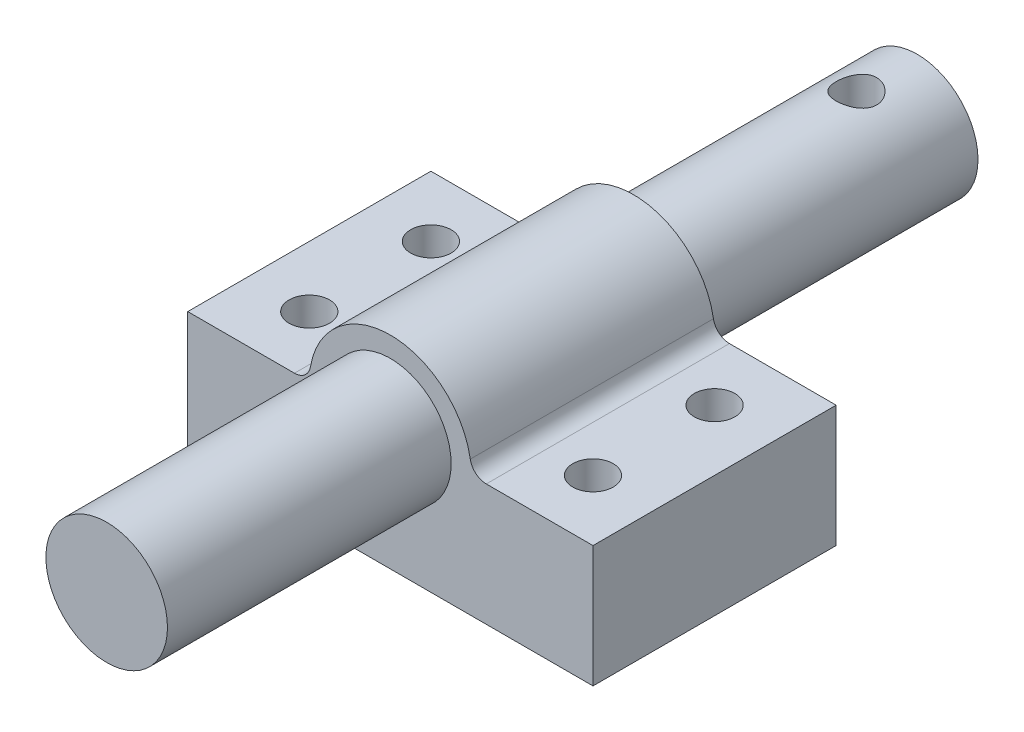
ISO-10303-21;
HEADER;
FILE_DESCRIPTION(('STEP AP214'),'2;1');
FILE_NAME('part.step','',(''),(''),'','','');
FILE_SCHEMA(('AUTOMOTIVE_DESIGN { 1 0 10303 214 1 1 1 1 }'));
ENDSEC;
DATA;
#1=APPLICATION_CONTEXT('core data for automotive mechanical design processes');
#2=APPLICATION_PROTOCOL_DEFINITION('international standard','automotive_design',2000,#1);
#3=PRODUCT_CONTEXT('',#1,'mechanical');
#4=PRODUCT('Part','Part','',(#3));
#5=PRODUCT_RELATED_PRODUCT_CATEGORY('part','',(#4));
#6=PRODUCT_DEFINITION_FORMATION('','',#4);
#7=PRODUCT_DEFINITION_CONTEXT('part definition',#1,'design');
#8=PRODUCT_DEFINITION('design','',#6,#7);
#9=PRODUCT_DEFINITION_SHAPE('','',#8);
#10=(LENGTH_UNIT() NAMED_UNIT(*) SI_UNIT(.MILLI.,.METRE.));
#11=(NAMED_UNIT(*) PLANE_ANGLE_UNIT() SI_UNIT($,.RADIAN.));
#12=(NAMED_UNIT(*) SI_UNIT($,.STERADIAN.) SOLID_ANGLE_UNIT());
#13=UNCERTAINTY_MEASURE_WITH_UNIT(LENGTH_MEASURE(1.E-05),#10,'distance_accuracy_value','');
#14=(GEOMETRIC_REPRESENTATION_CONTEXT(3) GLOBAL_UNCERTAINTY_ASSIGNED_CONTEXT((#13)) GLOBAL_UNIT_ASSIGNED_CONTEXT((#10,
#11,#12)) REPRESENTATION_CONTEXT('',''));
#15=CARTESIAN_POINT('',(0.,0.,0.));
#16=DIRECTION('',(0.,0.,1.));
#17=DIRECTION('',(1.,0.,0.));
#18=AXIS2_PLACEMENT_3D('',#15,#16,#17);
#19=CARTESIAN_POINT('',(7.5,0.,0.));
#20=DIRECTION('',(0.,0.,1.));
#21=DIRECTION('',(1.,0.,0.));
#22=AXIS2_PLACEMENT_3D('',#19,#20,#21);
#23=PLANE('',#22);
#24=CARTESIAN_POINT('',(0.,0.,0.));
#25=DIRECTION('',(0.,0.,1.));
#26=DIRECTION('',(1.,0.,0.));
#27=AXIS2_PLACEMENT_3D('',#24,#25,#26);
#28=CIRCLE('',#27,7.5);
#29=CARTESIAN_POINT('',(7.5,0.,0.));
#30=VERTEX_POINT('',#29);
#31=EDGE_CURVE('E112',#30,#30,#28,.T.);
#32=ORIENTED_EDGE('',*,*,#31,.T.);
#33=EDGE_LOOP('',(#32));
#34=FACE_BOUND('',#33,.T.);
#35=ADVANCED_FACE('F33',(#34),#23,.T.);
#36=CARTESIAN_POINT('',(7.5,0.,-35.));
#37=DIRECTION('',(0.,0.,1.));
#38=DIRECTION('',(1.,0.,0.));
#39=AXIS2_PLACEMENT_3D('',#36,#37,#38);
#40=PLANE('',#39);
#41=CARTESIAN_POINT('',(0.,0.,-35.));
#42=DIRECTION('',(0.,0.,1.));
#43=DIRECTION('',(1.,0.,0.));
#44=AXIS2_PLACEMENT_3D('',#41,#42,#43);
#45=CIRCLE('',#44,7.5);
#46=CARTESIAN_POINT('',(7.5,0.,-35.));
#47=VERTEX_POINT('',#46);
#48=EDGE_CURVE('E174',#47,#47,#45,.T.);
#49=ORIENTED_EDGE('',*,*,#48,.F.);
#50=EDGE_LOOP('',(#49));
#51=FACE_BOUND('',#50,.T.);
#52=DIRECTION('',(-1.,0.,0.));
#53=VECTOR('',#52,1.);
#54=CARTESIAN_POINT('',(25.,0.,-35.));
#55=LINE('',#54,#53);
#56=CARTESIAN_POINT('',(25.,0.,-35.));
#57=VERTEX_POINT('',#56);
#58=CARTESIAN_POINT('',(11.8321595661992,0.,-35.));
#59=VERTEX_POINT('',#58);
#60=EDGE_CURVE('E147',#57,#59,#55,.T.);
#61=ORIENTED_EDGE('',*,*,#60,.T.);
#62=CARTESIAN_POINT('',(11.8321595661992,2.,-35.));
#63=DIRECTION('',(0.,0.,-1.));
#64=DIRECTION('',(-1.,0.,0.));
#65=AXIS2_PLACEMENT_3D('',#62,#63,#64);
#66=CIRCLE('',#65,2.);
#67=CARTESIAN_POINT('',(9.86013297183269,1.66666666666667,-35.));
#68=VERTEX_POINT('',#67);
#69=EDGE_CURVE('E109',#59,#68,#66,.T.);
#70=ORIENTED_EDGE('',*,*,#69,.T.);
#71=CARTESIAN_POINT('',(0.,0.,-35.));
#72=DIRECTION('',(0.,0.,1.));
#73=DIRECTION('',(1.,0.,0.));
#74=AXIS2_PLACEMENT_3D('',#71,#72,#73);
#75=CIRCLE('',#74,10.);
#76=CARTESIAN_POINT('',(-9.86013297183269,1.66666666666667,-35.));
#77=VERTEX_POINT('',#76);
#78=EDGE_CURVE('E150',#68,#77,#75,.T.);
#79=ORIENTED_EDGE('',*,*,#78,.T.);
#80=CARTESIAN_POINT('',(-11.8321595661992,2.,-35.));
#81=DIRECTION('',(0.,0.,-1.));
#82=DIRECTION('',(1.,0.,0.));
#83=AXIS2_PLACEMENT_3D('',#80,#81,#82);
#84=CIRCLE('',#83,2.);
#85=CARTESIAN_POINT('',(-11.8321595661992,0.,-35.));
#86=VERTEX_POINT('',#85);
#87=EDGE_CURVE('E152',#77,#86,#84,.T.);
#88=ORIENTED_EDGE('',*,*,#87,.T.);
#89=DIRECTION('',(-1.,0.,0.));
#90=VECTOR('',#89,1.);
#91=CARTESIAN_POINT('',(-12.5,0.,-35.));
#92=LINE('',#91,#90);
#93=CARTESIAN_POINT('',(-25.,0.,-35.));
#94=VERTEX_POINT('',#93);
#95=EDGE_CURVE('E154',#86,#94,#92,.T.);
#96=ORIENTED_EDGE('',*,*,#95,.T.);
#97=DIRECTION('',(0.,-1.,0.));
#98=VECTOR('',#97,1.);
#99=CARTESIAN_POINT('',(-25.,-10.,-35.));
#100=LINE('',#99,#98);
#101=CARTESIAN_POINT('',(-25.,-15.,-35.));
#102=VERTEX_POINT('',#101);
#103=EDGE_CURVE('E156',#94,#102,#100,.T.);
#104=ORIENTED_EDGE('',*,*,#103,.T.);
#105=DIRECTION('',(1.,0.,0.));
#106=VECTOR('',#105,1.);
#107=CARTESIAN_POINT('',(-25.,-15.,-35.));
#108=LINE('',#107,#106);
#109=CARTESIAN_POINT('',(25.,-15.,-35.));
#110=VERTEX_POINT('',#109);
#111=EDGE_CURVE('E58',#102,#110,#108,.T.);
#112=ORIENTED_EDGE('',*,*,#111,.T.);
#113=DIRECTION('',(0.,1.,0.));
#114=VECTOR('',#113,1.);
#115=CARTESIAN_POINT('',(25.,-15.,-35.));
#116=LINE('',#115,#114);
#117=EDGE_CURVE('E53',#110,#57,#116,.T.);
#118=ORIENTED_EDGE('',*,*,#117,.T.);
#119=EDGE_LOOP('',(#61,#70,#79,#88,#96,#104,#112,#118));
#120=FACE_BOUND('',#119,.T.);
#121=ADVANCED_FACE('F255',(#51,#120),#40,.T.);
#122=CARTESIAN_POINT('',(0.,0.,-90.));
#123=DIRECTION('',(0.,0.,1.));
#124=DIRECTION('',(1.,0.,0.));
#125=AXIS2_PLACEMENT_3D('',#122,#123,#124);
#126=CYLINDRICAL_SURFACE('',#125,7.5);
#127=ORIENTED_EDGE('',*,*,#48,.T.);
#128=EDGE_LOOP('',(#127));
#129=FACE_BOUND('',#128,.T.);
#130=ORIENTED_EDGE('',*,*,#31,.F.);
#131=EDGE_LOOP('',(#130));
#132=FACE_BOUND('',#131,.T.);
#133=ADVANCED_FACE('F251',(#129,#132),#126,.T.);
#134=CARTESIAN_POINT('',(12.5,0.,-35.));
#135=DIRECTION('',(0.,-1.,0.));
#136=DIRECTION('',(0.,0.,-1.));
#137=AXIS2_PLACEMENT_3D('',#134,#135,#136);
#138=PLANE('',#137);
#139=CARTESIAN_POINT('',(17.5,0.,-42.5));
#140=DIRECTION('',(0.,1.,0.));
#141=DIRECTION('',(0.,0.,1.));
#142=AXIS2_PLACEMENT_3D('',#139,#140,#141);
#143=CIRCLE('',#142,2.5);
#144=CARTESIAN_POINT('',(17.5,0.,-40.));
#145=VERTEX_POINT('',#144);
#146=EDGE_CURVE('E189',#145,#145,#143,.T.);
#147=ORIENTED_EDGE('',*,*,#146,.F.);
#148=EDGE_LOOP('',(#147));
#149=FACE_BOUND('',#148,.T.);
#150=CARTESIAN_POINT('',(17.5,0.,-57.5));
#151=DIRECTION('',(0.,1.,0.));
#152=DIRECTION('',(0.,0.,-1.));
#153=AXIS2_PLACEMENT_3D('',#150,#151,#152);
#154=CIRCLE('',#153,2.5);
#155=CARTESIAN_POINT('',(17.5,0.,-60.));
#156=VERTEX_POINT('',#155);
#157=EDGE_CURVE('E185',#156,#156,#154,.T.);
#158=ORIENTED_EDGE('',*,*,#157,.F.);
#159=EDGE_LOOP('',(#158));
#160=FACE_BOUND('',#159,.T.);
#161=DIRECTION('',(0.,0.,-1.));
#162=VECTOR('',#161,1.);
#163=CARTESIAN_POINT('',(25.,0.,-35.));
#164=LINE('',#163,#162);
#165=CARTESIAN_POINT('',(25.,0.,-65.));
#166=VERTEX_POINT('',#165);
#167=EDGE_CURVE('E118',#57,#166,#164,.T.);
#168=ORIENTED_EDGE('',*,*,#167,.T.);
#169=DIRECTION('',(-1.,0.,0.));
#170=VECTOR('',#169,1.);
#171=CARTESIAN_POINT('',(25.,0.,-65.));
#172=LINE('',#171,#170);
#173=CARTESIAN_POINT('',(11.8321595661992,0.,-65.));
#174=VERTEX_POINT('',#173);
#175=EDGE_CURVE('E116',#166,#174,#172,.T.);
#176=ORIENTED_EDGE('',*,*,#175,.T.);
#177=DIRECTION('',(0.,0.,-1.));
#178=VECTOR('',#177,1.);
#179=CARTESIAN_POINT('',(11.8321595661992,0.,-35.));
#180=LINE('',#179,#178);
#181=EDGE_CURVE('E103',#59,#174,#180,.T.);
#182=ORIENTED_EDGE('',*,*,#181,.F.);
#183=ORIENTED_EDGE('',*,*,#60,.F.);
#184=EDGE_LOOP('',(#168,#176,#182,#183));
#185=FACE_BOUND('',#184,.T.);
#186=ADVANCED_FACE('F117',(#149,#160,#185),#138,.F.);
#187=CARTESIAN_POINT('',(11.8321595661992,2.,-35.));
#188=DIRECTION('',(0.,0.,-1.));
#189=DIRECTION('',(-1.,0.,0.));
#190=AXIS2_PLACEMENT_3D('',#187,#188,#189);
#191=CYLINDRICAL_SURFACE('',#190,2.);
#192=ORIENTED_EDGE('',*,*,#181,.T.);
#193=CARTESIAN_POINT('',(11.8321595661992,2.,-65.));
#194=DIRECTION('',(0.,0.,-1.));
#195=DIRECTION('',(-1.,0.,0.));
#196=AXIS2_PLACEMENT_3D('',#193,#194,#195);
#197=CIRCLE('',#196,2.);
#198=CARTESIAN_POINT('',(9.86013297183269,1.66666666666667,-65.));
#199=VERTEX_POINT('',#198);
#200=EDGE_CURVE('E108',#174,#199,#197,.T.);
#201=ORIENTED_EDGE('',*,*,#200,.T.);
#202=DIRECTION('',(0.,0.,-1.));
#203=VECTOR('',#202,1.);
#204=CARTESIAN_POINT('',(9.86013297183269,1.66666666666667,-35.));
#205=LINE('',#204,#203);
#206=EDGE_CURVE('E113',#68,#199,#205,.T.);
#207=ORIENTED_EDGE('',*,*,#206,.F.);
#208=ORIENTED_EDGE('',*,*,#69,.F.);
#209=EDGE_LOOP('',(#192,#201,#207,#208));
#210=FACE_BOUND('',#209,.T.);
#211=ADVANCED_FACE('F105',(#210),#191,.F.);
#212=CARTESIAN_POINT('',(0.,0.,-35.));
#213=DIRECTION('',(0.,0.,-1.));
#214=DIRECTION('',(-1.,0.,0.));
#215=AXIS2_PLACEMENT_3D('',#212,#213,#214);
#216=CYLINDRICAL_SURFACE('',#215,10.);
#217=ORIENTED_EDGE('',*,*,#206,.T.);
#218=CARTESIAN_POINT('',(0.,0.,-65.));
#219=DIRECTION('',(0.,0.,1.));
#220=DIRECTION('',(1.,0.,0.));
#221=AXIS2_PLACEMENT_3D('',#218,#219,#220);
#222=CIRCLE('',#221,10.);
#223=CARTESIAN_POINT('',(-9.86013297183269,1.66666666666667,-65.));
#224=VERTEX_POINT('',#223);
#225=EDGE_CURVE('E128',#199,#224,#222,.T.);
#226=ORIENTED_EDGE('',*,*,#225,.T.);
#227=DIRECTION('',(0.,0.,-1.));
#228=VECTOR('',#227,1.);
#229=CARTESIAN_POINT('',(-9.86013297183269,1.66666666666667,-35.));
#230=LINE('',#229,#228);
#231=EDGE_CURVE('E169',#77,#224,#230,.T.);
#232=ORIENTED_EDGE('',*,*,#231,.F.);
#233=ORIENTED_EDGE('',*,*,#78,.F.);
#234=EDGE_LOOP('',(#217,#226,#232,#233));
#235=FACE_BOUND('',#234,.T.);
#236=ADVANCED_FACE('F242',(#235),#216,.T.);
#237=CARTESIAN_POINT('',(-11.8321595661992,2.,-35.));
#238=DIRECTION('',(0.,0.,-1.));
#239=DIRECTION('',(-1.,0.,0.));
#240=AXIS2_PLACEMENT_3D('',#237,#238,#239);
#241=CYLINDRICAL_SURFACE('',#240,2.);
#242=ORIENTED_EDGE('',*,*,#231,.T.);
#243=CARTESIAN_POINT('',(-11.8321595661992,2.,-65.));
#244=DIRECTION('',(0.,0.,-1.));
#245=DIRECTION('',(1.,0.,0.));
#246=AXIS2_PLACEMENT_3D('',#243,#244,#245);
#247=CIRCLE('',#246,2.);
#248=CARTESIAN_POINT('',(-11.8321595661992,0.,-65.));
#249=VERTEX_POINT('',#248);
#250=EDGE_CURVE('E130',#224,#249,#247,.T.);
#251=ORIENTED_EDGE('',*,*,#250,.T.);
#252=DIRECTION('',(0.,0.,-1.));
#253=VECTOR('',#252,1.);
#254=CARTESIAN_POINT('',(-11.8321595661992,0.,-35.));
#255=LINE('',#254,#253);
#256=EDGE_CURVE('E167',#86,#249,#255,.T.);
#257=ORIENTED_EDGE('',*,*,#256,.F.);
#258=ORIENTED_EDGE('',*,*,#87,.F.);
#259=EDGE_LOOP('',(#242,#251,#257,#258));
#260=FACE_BOUND('',#259,.T.);
#261=ADVANCED_FACE('F238',(#260),#241,.F.);
#262=CARTESIAN_POINT('',(-25.,0.,-35.));
#263=DIRECTION('',(0.,-1.,0.));
#264=DIRECTION('',(0.,0.,-1.));
#265=AXIS2_PLACEMENT_3D('',#262,#263,#264);
#266=PLANE('',#265);
#267=CARTESIAN_POINT('',(-17.5,0.,-42.5));
#268=DIRECTION('',(0.,1.,0.));
#269=DIRECTION('',(0.,0.,-1.));
#270=AXIS2_PLACEMENT_3D('',#267,#268,#269);
#271=CIRCLE('',#270,2.5);
#272=CARTESIAN_POINT('',(-17.5,0.,-45.));
#273=VERTEX_POINT('',#272);
#274=EDGE_CURVE('E192',#273,#273,#271,.T.);
#275=ORIENTED_EDGE('',*,*,#274,.F.);
#276=EDGE_LOOP('',(#275));
#277=FACE_BOUND('',#276,.T.);
#278=CARTESIAN_POINT('',(-17.5,0.,-57.5));
#279=DIRECTION('',(0.,1.,0.));
#280=DIRECTION('',(0.,0.,1.));
#281=AXIS2_PLACEMENT_3D('',#278,#279,#280);
#282=CIRCLE('',#281,2.5);
#283=CARTESIAN_POINT('',(-17.5,0.,-55.));
#284=VERTEX_POINT('',#283);
#285=EDGE_CURVE('E181',#284,#284,#282,.T.);
#286=ORIENTED_EDGE('',*,*,#285,.F.);
#287=EDGE_LOOP('',(#286));
#288=FACE_BOUND('',#287,.T.);
#289=ORIENTED_EDGE('',*,*,#256,.T.);
#290=DIRECTION('',(-1.,0.,0.));
#291=VECTOR('',#290,1.);
#292=CARTESIAN_POINT('',(-12.5,0.,-65.));
#293=LINE('',#292,#291);
#294=CARTESIAN_POINT('',(-25.,0.,-65.));
#295=VERTEX_POINT('',#294);
#296=EDGE_CURVE('E136',#249,#295,#293,.T.);
#297=ORIENTED_EDGE('',*,*,#296,.T.);
#298=DIRECTION('',(0.,0.,-1.));
#299=VECTOR('',#298,1.);
#300=CARTESIAN_POINT('',(-25.,0.,-35.));
#301=LINE('',#300,#299);
#302=EDGE_CURVE('E165',#94,#295,#301,.T.);
#303=ORIENTED_EDGE('',*,*,#302,.F.);
#304=ORIENTED_EDGE('',*,*,#95,.F.);
#305=EDGE_LOOP('',(#289,#297,#303,#304));
#306=FACE_BOUND('',#305,.T.);
#307=ADVANCED_FACE('F234',(#277,#288,#306),#266,.F.);
#308=CARTESIAN_POINT('',(-25.,-10.,-35.));
#309=DIRECTION('',(1.,0.,0.));
#310=DIRECTION('',(0.,0.,-1.));
#311=AXIS2_PLACEMENT_3D('',#308,#309,#310);
#312=PLANE('',#311);
#313=ORIENTED_EDGE('',*,*,#302,.T.);
#314=DIRECTION('',(0.,-1.,0.));
#315=VECTOR('',#314,1.);
#316=CARTESIAN_POINT('',(-25.,-10.,-65.));
#317=LINE('',#316,#315);
#318=CARTESIAN_POINT('',(-25.,-15.,-65.));
#319=VERTEX_POINT('',#318);
#320=EDGE_CURVE('E139',#295,#319,#317,.T.);
#321=ORIENTED_EDGE('',*,*,#320,.T.);
#322=DIRECTION('',(0.,0.,-1.));
#323=VECTOR('',#322,1.);
#324=CARTESIAN_POINT('',(-25.,-15.,-35.));
#325=LINE('',#324,#323);
#326=EDGE_CURVE('E163',#102,#319,#325,.T.);
#327=ORIENTED_EDGE('',*,*,#326,.F.);
#328=ORIENTED_EDGE('',*,*,#103,.F.);
#329=EDGE_LOOP('',(#313,#321,#327,#328));
#330=FACE_BOUND('',#329,.T.);
#331=ADVANCED_FACE('F230',(#330),#312,.F.);
#332=CARTESIAN_POINT('',(-25.,-15.,-35.));
#333=DIRECTION('',(0.,1.,0.));
#334=DIRECTION('',(0.,0.,1.));
#335=AXIS2_PLACEMENT_3D('',#332,#333,#334);
#336=PLANE('',#335);
#337=CARTESIAN_POINT('',(-17.5,-15.,-42.5));
#338=DIRECTION('',(0.,1.,0.));
#339=DIRECTION('',(0.,0.,1.));
#340=AXIS2_PLACEMENT_3D('',#337,#338,#339);
#341=CIRCLE('',#340,2.5);
#342=CARTESIAN_POINT('',(-17.5,-15.,-40.));
#343=VERTEX_POINT('',#342);
#344=EDGE_CURVE('E190',#343,#343,#341,.T.);
#345=ORIENTED_EDGE('',*,*,#344,.T.);
#346=EDGE_LOOP('',(#345));
#347=FACE_BOUND('',#346,.T.);
#348=CARTESIAN_POINT('',(17.5,-15.,-42.5));
#349=DIRECTION('',(0.,1.,0.));
#350=DIRECTION('',(0.,0.,1.));
#351=AXIS2_PLACEMENT_3D('',#348,#349,#350);
#352=CIRCLE('',#351,2.5);
#353=CARTESIAN_POINT('',(17.5,-15.,-40.));
#354=VERTEX_POINT('',#353);
#355=EDGE_CURVE('E186',#354,#354,#352,.T.);
#356=ORIENTED_EDGE('',*,*,#355,.T.);
#357=EDGE_LOOP('',(#356));
#358=FACE_BOUND('',#357,.T.);
#359=CARTESIAN_POINT('',(17.5,-15.,-57.5));
#360=DIRECTION('',(0.,1.,0.));
#361=DIRECTION('',(0.,0.,1.));
#362=AXIS2_PLACEMENT_3D('',#359,#360,#361);
#363=CIRCLE('',#362,2.5);
#364=CARTESIAN_POINT('',(17.5,-15.,-55.));
#365=VERTEX_POINT('',#364);
#366=EDGE_CURVE('E182',#365,#365,#363,.T.);
#367=ORIENTED_EDGE('',*,*,#366,.T.);
#368=EDGE_LOOP('',(#367));
#369=FACE_BOUND('',#368,.T.);
#370=CARTESIAN_POINT('',(-17.5,-15.,-57.5));
#371=DIRECTION('',(0.,1.,0.));
#372=DIRECTION('',(0.,0.,1.));
#373=AXIS2_PLACEMENT_3D('',#370,#371,#372);
#374=CIRCLE('',#373,2.5);
#375=CARTESIAN_POINT('',(-17.5,-15.,-55.));
#376=VERTEX_POINT('',#375);
#377=EDGE_CURVE('E122',#376,#376,#374,.T.);
#378=ORIENTED_EDGE('',*,*,#377,.T.);
#379=EDGE_LOOP('',(#378));
#380=FACE_BOUND('',#379,.T.);
#381=ORIENTED_EDGE('',*,*,#326,.T.);
#382=DIRECTION('',(1.,0.,0.));
#383=VECTOR('',#382,1.);
#384=CARTESIAN_POINT('',(-25.,-15.,-65.));
#385=LINE('',#384,#383);
#386=CARTESIAN_POINT('',(25.,-15.,-65.));
#387=VERTEX_POINT('',#386);
#388=EDGE_CURVE('E142',#319,#387,#385,.T.);
#389=ORIENTED_EDGE('',*,*,#388,.T.);
#390=DIRECTION('',(0.,0.,-1.));
#391=VECTOR('',#390,1.);
#392=CARTESIAN_POINT('',(25.,-15.,-35.));
#393=LINE('',#392,#391);
#394=EDGE_CURVE('E161',#110,#387,#393,.T.);
#395=ORIENTED_EDGE('',*,*,#394,.F.);
#396=ORIENTED_EDGE('',*,*,#111,.F.);
#397=EDGE_LOOP('',(#381,#389,#395,#396));
#398=FACE_BOUND('',#397,.T.);
#399=ADVANCED_FACE('F226',(#347,#358,#369,#380,#398),#336,.F.);
#400=CARTESIAN_POINT('',(25.,-10.,-35.));
#401=DIRECTION('',(-1.,0.,0.));
#402=DIRECTION('',(0.,0.,1.));
#403=AXIS2_PLACEMENT_3D('',#400,#401,#402);
#404=PLANE('',#403);
#405=ORIENTED_EDGE('',*,*,#394,.T.);
#406=DIRECTION('',(0.,1.,0.));
#407=VECTOR('',#406,1.);
#408=CARTESIAN_POINT('',(25.,-15.,-65.));
#409=LINE('',#408,#407);
#410=EDGE_CURVE('E145',#387,#166,#409,.T.);
#411=ORIENTED_EDGE('',*,*,#410,.T.);
#412=ORIENTED_EDGE('',*,*,#167,.F.);
#413=ORIENTED_EDGE('',*,*,#117,.F.);
#414=EDGE_LOOP('',(#405,#411,#412,#413));
#415=FACE_BOUND('',#414,.T.);
#416=ADVANCED_FACE('F222',(#415),#404,.F.);
#417=CARTESIAN_POINT('',(2.,0.,-100.));
#418=DIRECTION('',(0.,0.,-1.));
#419=DIRECTION('',(-1.,0.,0.));
#420=AXIS2_PLACEMENT_3D('',#417,#418,#419);
#421=PLANE('',#420);
#422=CARTESIAN_POINT('',(0.,0.,-100.));
#423=DIRECTION('',(0.,0.,1.));
#424=DIRECTION('',(1.,0.,0.));
#425=AXIS2_PLACEMENT_3D('',#422,#423,#424);
#426=CIRCLE('',#425,7.5);
#427=CARTESIAN_POINT('',(7.5,0.,-100.));
#428=VERTEX_POINT('',#427);
#429=EDGE_CURVE('E11',#428,#428,#426,.T.);
#430=ORIENTED_EDGE('',*,*,#429,.F.);
#431=EDGE_LOOP('',(#430));
#432=FACE_BOUND('',#431,.T.);
#433=ADVANCED_FACE('F225',(#432),#421,.T.);
#434=CARTESIAN_POINT('',(0.,0.,-90.));
#435=DIRECTION('',(0.,0.,1.));
#436=DIRECTION('',(1.,0.,0.));
#437=AXIS2_PLACEMENT_3D('',#434,#435,#436);
#438=CYLINDRICAL_SURFACE('',#437,7.5);
#439=CARTESIAN_POINT('',(0.,-7.5,-90.));
#440=CARTESIAN_POINT('',(-0.136408407216807,-7.5000003825236,-89.9999993656709));
#441=CARTESIAN_POINT('',(-0.272812986346374,-7.49624423768862,-90.011200665318));
#442=CARTESIAN_POINT('',(-0.541604402182429,-7.48163025508202,-90.055572772043));
#443=CARTESIAN_POINT('',(-0.673990820297043,-7.47077168005382,-90.0887458598723));
#444=CARTESIAN_POINT('',(-0.930831973754438,-7.44313269766107,-90.1757981084601));
#445=CARTESIAN_POINT('',(-1.05529956471508,-7.42636219327133,-90.2296426561482));
#446=CARTESIAN_POINT('',(-1.29343734201331,-7.38861114293355,-90.3563529320959));
#447=CARTESIAN_POINT('',(-1.40710539239676,-7.36762976669445,-90.4292224125065));
#448=CARTESIAN_POINT('',(-1.62435418755566,-7.32285236107513,-90.5945645121469));
#449=CARTESIAN_POINT('',(-1.72750925074577,-7.29898891159462,-90.6875780856512));
#450=CARTESIAN_POINT('',(-1.91708173175521,-7.25150786957804,-90.8894178867664));
#451=CARTESIAN_POINT('',(-2.00349546372366,-7.22789033226373,-90.9982475873213));
#452=CARTESIAN_POINT('',(-2.15956235556965,-7.18283331193185,-91.2324627879911));
#453=CARTESIAN_POINT('',(-2.22866214555258,-7.16147598189221,-91.3582343493303));
#454=CARTESIAN_POINT('',(-2.3445471846943,-7.12438263546503,-91.6204402361464));
#455=CARTESIAN_POINT('',(-2.39133924346691,-7.10864490401864,-91.7568712929069));
#456=CARTESIAN_POINT('',(-2.45968365377291,-7.08528258173443,-92.0316830537418));
#457=CARTESIAN_POINT('',(-2.48203362067942,-7.07740239424028,-92.1698430212227));
#458=CARTESIAN_POINT('',(-2.50335280833619,-7.06989141573769,-92.4481593853897));
#459=CARTESIAN_POINT('',(-2.5023292540118,-7.07025807556825,-92.588315151773));
#460=CARTESIAN_POINT('',(-2.47754975925855,-7.07897537520451,-92.85984157611));
#461=CARTESIAN_POINT('',(-2.45483478291749,-7.08696039668833,-92.9913210072975));
#462=CARTESIAN_POINT('',(-2.38901540712354,-7.10941644311378,-93.2484835490171));
#463=CARTESIAN_POINT('',(-2.34590856647968,-7.12388824460269,-93.3741659635877));
#464=CARTESIAN_POINT('',(-2.23984764515053,-7.15794777828122,-93.6185318739787));
#465=CARTESIAN_POINT('',(-2.17658512176816,-7.17761414482793,-93.7370700636738));
#466=CARTESIAN_POINT('',(-2.03222276575784,-7.21981396439316,-93.9621772706993));
#467=CARTESIAN_POINT('',(-1.95111778091001,-7.24234824476159,-94.0687428173334));
#468=CARTESIAN_POINT('',(-1.76837333170559,-7.28918322919353,-94.2727289954019));
#469=CARTESIAN_POINT('',(-1.66588287519077,-7.31351473387107,-94.3693817362727));
#470=CARTESIAN_POINT('',(-1.44584892492516,-7.36017345967592,-94.5443281666585));
#471=CARTESIAN_POINT('',(-1.32830398915203,-7.38250048845169,-94.6226200954112));
#472=CARTESIAN_POINT('',(-1.07986903261566,-7.42292769844484,-94.7592407505877));
#473=CARTESIAN_POINT('',(-0.948858191040837,-7.44098375020098,-94.8173637283518));
#474=CARTESIAN_POINT('',(-0.678172708411267,-7.47051417861087,-94.9105079348893));
#475=CARTESIAN_POINT('',(-0.538501095387384,-7.48199084137198,-94.9455371885586));
#476=CARTESIAN_POINT('',(-0.26095957382326,-7.49669067678601,-94.9901391650559));
#477=CARTESIAN_POINT('',(-0.123273999662114,-7.5002500458432,-95.0007495229319));
#478=CARTESIAN_POINT('',(0.151937674900596,-7.49972256737069,-94.9991683160038));
#479=CARTESIAN_POINT('',(0.289463798299129,-7.49563701048406,-94.9869806000503));
#480=CARTESIAN_POINT('',(0.556299665760642,-7.48050061792761,-94.9409702306601));
#481=CARTESIAN_POINT('',(0.685732017087112,-7.46965496777981,-94.9077844848763));
#482=CARTESIAN_POINT('',(0.937139896448936,-7.44229617075175,-94.8215163888332));
#483=CARTESIAN_POINT('',(1.05911447127152,-7.42578230116688,-94.7684315013305));
#484=CARTESIAN_POINT('',(1.29572074098318,-7.38822328218225,-94.642323920398));
#485=CARTESIAN_POINT('',(1.41007489804286,-7.36707036889465,-94.5688135167921));
#486=CARTESIAN_POINT('',(1.62516207533897,-7.32263134790656,-94.4045146249663));
#487=CARTESIAN_POINT('',(1.72589091948894,-7.29934458984569,-94.3137208599206));
#488=CARTESIAN_POINT('',(1.91563126951575,-7.25192119951112,-94.1125531224835));
#489=CARTESIAN_POINT('',(2.00390242311442,-7.2277940271857,-94.0014769326828));
#490=CARTESIAN_POINT('',(2.16064380580893,-7.18249933236772,-93.7655710804728));
#491=CARTESIAN_POINT('',(2.22911386982753,-7.16133183455006,-93.6407413034148));
#492=CARTESIAN_POINT('',(2.3439923260409,-7.12455979478459,-93.3808174617753));
#493=CARTESIAN_POINT('',(2.39044533041255,-7.10894401982447,-93.2457448020781));
#494=CARTESIAN_POINT('',(2.45973666689839,-7.08527080766124,-92.9690533748897));
#495=CARTESIAN_POINT('',(2.48258563738485,-7.07720996559099,-92.8274375864891));
#496=CARTESIAN_POINT('',(2.50319070619336,-7.06994647185443,-92.5495072598977));
#497=CARTESIAN_POINT('',(2.502175643271,-7.07031000643538,-92.4132941492829));
#498=CARTESIAN_POINT('',(2.47810573362174,-7.07878174559668,-92.1430873126949));
#499=CARTESIAN_POINT('',(2.45505219864647,-7.08688948923404,-92.0090934551123));
#500=CARTESIAN_POINT('',(2.38842953282337,-7.10961310762229,-91.7496608424938));
#501=CARTESIAN_POINT('',(2.34525836503879,-7.12410245056194,-91.6241079374888));
#502=CARTESIAN_POINT('',(2.23994841439937,-7.15790997046171,-91.3819314826543));
#503=CARTESIAN_POINT('',(2.17780542138451,-7.17722921908483,-91.26530992203));
#504=CARTESIAN_POINT('',(2.03315173145857,-7.21957073065116,-91.0387908251927));
#505=CARTESIAN_POINT('',(1.94987060691145,-7.24271779105343,-90.929408745254));
#506=CARTESIAN_POINT('',(1.76660720783913,-7.28958390708132,-90.7257754665395));
#507=CARTESIAN_POINT('',(1.66662021112871,-7.31330312280931,-90.6315285607798));
#508=CARTESIAN_POINT('',(1.44810389230172,-7.3597507631386,-90.4571389692771));
#509=CARTESIAN_POINT('',(1.32900378374933,-7.38240454503142,-90.3776891306225));
#510=CARTESIAN_POINT('',(1.07839339351656,-7.4231497793153,-90.2400239278734));
#511=CARTESIAN_POINT('',(0.946886295330869,-7.44124239769825,-90.1818031351949));
#512=CARTESIAN_POINT('',(0.681234118002434,-7.47013787671355,-90.0906959187783));
#513=CARTESIAN_POINT('',(0.547469394191017,-7.48123031056307,-90.0567938343415));
#514=CARTESIAN_POINT('',(0.275801040025616,-7.49616017660555,-90.0114492983072));
#515=CARTESIAN_POINT('',(0.137898563921866,-7.49999961329762,-90.0000006412587));
#516=CARTESIAN_POINT('',(0.,-7.5,-90.));
#517=B_SPLINE_CURVE_WITH_KNOTS('',3,(#439,#440,#441,#442,#443,#444,#445,#446,#447,#448,#449,
#450,#451,#452,#453,#454,#455,#456,#457,#458,#459,#460,#461,#462,#463,#464,#465,#466,#467,#468,
#469,#470,#471,#472,#473,#474,#475,#476,#477,#478,#479,#480,#481,#482,#483,#484,#485,#486,#487,
#488,#489,#490,#491,#492,#493,#494,#495,#496,#497,#498,#499,#500,#501,#502,#503,#504,#505,#506,
#507,#508,#509,#510,#511,#512,#513,#514,#515,#516),.UNSPECIFIED.,.T.,.F.,(4,2,2,2,2,2,2,2,2,2,2,
2,2,2,2,2,2,2,2,2,2,2,2,2,2,2,2,2,2,2,2,2,2,2,2,2,2,2,4),(0.,0.408717765065026,
0.817477963168803,1.22555668217568,1.63371594449775,2.0546171070689,2.47561083218826,
2.90870962058675,3.34167611732085,3.76004814354601,4.17829084968714,4.57742066378201,
4.97659827138706,5.38220427887827,5.78792756395519,6.21483264528419,6.64177864916546,
7.07296014125894,7.50399172193021,7.91633957937924,8.32861782910442,8.72895394945534,
9.1293411321026,9.54025999609341,9.95130452054727,10.3810255720188,10.8107502058749,
11.2396003456692,11.668257117646,12.0748916516065,12.4815019837844,12.8803896770104,
13.2793659543994,13.6957516672951,14.1122552780945,14.5449915208775,14.9776170288114,
15.3909139593453,15.8040966509535),.UNSPECIFIED.);
#518=CARTESIAN_POINT('',(0.,-7.5,-90.));
#519=VERTEX_POINT('',#518);
#520=EDGE_CURVE('E36',#519,#519,#517,.T.);
#521=ORIENTED_EDGE('',*,*,#520,.F.);
#522=EDGE_LOOP('',(#521));
#523=FACE_BOUND('',#522,.T.);
#524=CARTESIAN_POINT('',(0.,7.5,-90.));
#525=CARTESIAN_POINT('',(0.136408407216809,7.5000003825236,-89.9999993656709));
#526=CARTESIAN_POINT('',(0.272812986346376,7.49624423768862,-90.011200665318));
#527=CARTESIAN_POINT('',(0.541604402182432,7.48163025508202,-90.055572772043));
#528=CARTESIAN_POINT('',(0.673990820297045,7.47077168005381,-90.0887458598723));
#529=CARTESIAN_POINT('',(0.930831973754441,7.44313269766107,-90.1757981084601));
#530=CARTESIAN_POINT('',(1.05529956471509,7.42636219327133,-90.2296426561482));
#531=CARTESIAN_POINT('',(1.29343734201331,7.38861114293355,-90.3563529320959));
#532=CARTESIAN_POINT('',(1.40710539239677,7.36762976669445,-90.4292224125065));
#533=CARTESIAN_POINT('',(1.62435418755567,7.32285236107513,-90.5945645121469));
#534=CARTESIAN_POINT('',(1.72750925074577,7.29898891159462,-90.6875780856512));
#535=CARTESIAN_POINT('',(1.91708173175521,7.25150786957804,-90.8894178867664));
#536=CARTESIAN_POINT('',(2.00349546372366,7.22789033226373,-90.9982475873213));
#537=CARTESIAN_POINT('',(2.15956235556965,7.18283331193185,-91.2324627879911));
#538=CARTESIAN_POINT('',(2.22866214555258,7.16147598189221,-91.3582343493303));
#539=CARTESIAN_POINT('',(2.34454718469431,7.12438263546503,-91.6204402361464));
#540=CARTESIAN_POINT('',(2.39133924346691,7.10864490401864,-91.7568712929069));
#541=CARTESIAN_POINT('',(2.45968365377291,7.08528258173443,-92.0316830537418));
#542=CARTESIAN_POINT('',(2.48203362067943,7.07740239424028,-92.1698430212227));
#543=CARTESIAN_POINT('',(2.50335280833619,7.06989141573769,-92.4481593853897));
#544=CARTESIAN_POINT('',(2.5023292540118,7.07025807556825,-92.588315151773));
#545=CARTESIAN_POINT('',(2.47754975925855,7.07897537520451,-92.85984157611));
#546=CARTESIAN_POINT('',(2.45483478291749,7.08696039668832,-92.9913210072975));
#547=CARTESIAN_POINT('',(2.38901540712354,7.10941644311377,-93.2484835490171));
#548=CARTESIAN_POINT('',(2.34590856647968,7.12388824460269,-93.3741659635877));
#549=CARTESIAN_POINT('',(2.23984764515053,7.15794777828122,-93.6185318739787));
#550=CARTESIAN_POINT('',(2.17658512176816,7.17761414482793,-93.7370700636738));
#551=CARTESIAN_POINT('',(2.03222276575785,7.21981396439316,-93.9621772706993));
#552=CARTESIAN_POINT('',(1.95111778091001,7.24234824476159,-94.0687428173334));
#553=CARTESIAN_POINT('',(1.76837333170559,7.28918322919353,-94.2727289954019));
#554=CARTESIAN_POINT('',(1.66588287519077,7.31351473387107,-94.3693817362727));
#555=CARTESIAN_POINT('',(1.44584892492516,7.36017345967592,-94.5443281666585));
#556=CARTESIAN_POINT('',(1.32830398915203,7.38250048845169,-94.6226200954112));
#557=CARTESIAN_POINT('',(1.07986903261567,7.42292769844484,-94.7592407505877));
#558=CARTESIAN_POINT('',(0.948858191040839,7.44098375020098,-94.8173637283518));
#559=CARTESIAN_POINT('',(0.67817270841127,7.47051417861087,-94.9105079348893));
#560=CARTESIAN_POINT('',(0.538501095387387,7.48199084137198,-94.9455371885586));
#561=CARTESIAN_POINT('',(0.260959573823263,7.49669067678601,-94.9901391650559));
#562=CARTESIAN_POINT('',(0.123273999662117,7.5002500458432,-95.0007495229319));
#563=CARTESIAN_POINT('',(-0.151937674900594,7.49972256737069,-94.9991683160038));
#564=CARTESIAN_POINT('',(-0.289463798299127,7.49563701048406,-94.9869806000503));
#565=CARTESIAN_POINT('',(-0.55629966576064,7.48050061792761,-94.9409702306601));
#566=CARTESIAN_POINT('',(-0.68573201708711,7.46965496777981,-94.9077844848763));
#567=CARTESIAN_POINT('',(-0.937139896448935,7.44229617075175,-94.8215163888332));
#568=CARTESIAN_POINT('',(-1.05911447127152,7.42578230116688,-94.7684315013305));
#569=CARTESIAN_POINT('',(-1.29572074098318,7.38822328218225,-94.642323920398));
#570=CARTESIAN_POINT('',(-1.41007489804286,7.36707036889465,-94.5688135167921));
#571=CARTESIAN_POINT('',(-1.62516207533896,7.32263134790656,-94.4045146249663));
#572=CARTESIAN_POINT('',(-1.72589091948894,7.29934458984569,-94.3137208599206));
#573=CARTESIAN_POINT('',(-1.91563126951575,7.25192119951112,-94.1125531224835));
#574=CARTESIAN_POINT('',(-2.00390242311442,7.2277940271857,-94.0014769326828));
#575=CARTESIAN_POINT('',(-2.16064380580893,7.18249933236772,-93.7655710804728));
#576=CARTESIAN_POINT('',(-2.22911386982753,7.16133183455006,-93.6407413034148));
#577=CARTESIAN_POINT('',(-2.3439923260409,7.12455979478459,-93.3808174617753));
#578=CARTESIAN_POINT('',(-2.39044533041255,7.10894401982447,-93.2457448020781));
#579=CARTESIAN_POINT('',(-2.45973666689839,7.08527080766124,-92.9690533748897));
#580=CARTESIAN_POINT('',(-2.48258563738485,7.07720996559098,-92.8274375864891));
#581=CARTESIAN_POINT('',(-2.50319070619335,7.06994647185443,-92.5495072598977));
#582=CARTESIAN_POINT('',(-2.502175643271,7.07031000643538,-92.4132941492829));
#583=CARTESIAN_POINT('',(-2.47810573362173,7.07878174559669,-92.1430873126949));
#584=CARTESIAN_POINT('',(-2.45505219864646,7.08688948923404,-92.0090934551123));
#585=CARTESIAN_POINT('',(-2.38842953282336,7.10961310762229,-91.7496608424938));
#586=CARTESIAN_POINT('',(-2.34525836503879,7.12410245056194,-91.6241079374888));
#587=CARTESIAN_POINT('',(-2.23994841439937,7.15790997046172,-91.3819314826543));
#588=CARTESIAN_POINT('',(-2.17780542138451,7.17722921908483,-91.26530992203));
#589=CARTESIAN_POINT('',(-2.03315173145857,7.21957073065116,-91.0387908251927));
#590=CARTESIAN_POINT('',(-1.94987060691145,7.24271779105343,-90.929408745254));
#591=CARTESIAN_POINT('',(-1.76660720783912,7.28958390708132,-90.7257754665395));
#592=CARTESIAN_POINT('',(-1.66662021112871,7.31330312280931,-90.6315285607798));
#593=CARTESIAN_POINT('',(-1.44810389230172,7.3597507631386,-90.4571389692771));
#594=CARTESIAN_POINT('',(-1.32900378374933,7.38240454503142,-90.3776891306225));
#595=CARTESIAN_POINT('',(-1.07839339351656,7.4231497793153,-90.2400239278734));
#596=CARTESIAN_POINT('',(-0.946886295330868,7.44124239769825,-90.1818031351949));
#597=CARTESIAN_POINT('',(-0.681234118002434,7.47013787671355,-90.0906959187783));
#598=CARTESIAN_POINT('',(-0.547469394191017,7.48123031056307,-90.0567938343415));
#599=CARTESIAN_POINT('',(-0.275801040025615,7.49616017660555,-90.0114492983072));
#600=CARTESIAN_POINT('',(-0.137898563921864,7.49999961329762,-90.0000006412587));
#601=CARTESIAN_POINT('',(0.,7.5,-90.));
#602=B_SPLINE_CURVE_WITH_KNOTS('',3,(#524,#525,#526,#527,#528,#529,#530,#531,#532,#533,#534,
#535,#536,#537,#538,#539,#540,#541,#542,#543,#544,#545,#546,#547,#548,#549,#550,#551,#552,#553,
#554,#555,#556,#557,#558,#559,#560,#561,#562,#563,#564,#565,#566,#567,#568,#569,#570,#571,#572,
#573,#574,#575,#576,#577,#578,#579,#580,#581,#582,#583,#584,#585,#586,#587,#588,#589,#590,#591,
#592,#593,#594,#595,#596,#597,#598,#599,#600,#601),.UNSPECIFIED.,.T.,.F.,(4,2,2,2,2,2,2,2,2,2,2,
2,2,2,2,2,2,2,2,2,2,2,2,2,2,2,2,2,2,2,2,2,2,2,2,2,2,2,4),(0.,0.408717765065026,
0.817477963168805,1.22555668217569,1.63371594449775,2.0546171070689,2.47561083218826,
2.90870962058677,3.34167611732085,3.76004814354601,4.17829084968714,4.57742066378201,
4.97659827138706,5.38220427887827,5.78792756395519,6.21483264528419,6.64177864916546,
7.07296014125894,7.50399172193021,7.91633957937924,8.32861782910442,8.72895394945534,
9.1293411321026,9.54025999609341,9.95130452054728,10.3810255720188,10.8107502058749,
11.2396003456693,11.668257117646,12.0748916516065,12.4815019837844,12.8803896770104,
13.2793659543994,13.6957516672951,14.1122552780945,14.5449915208775,14.9776170288114,
15.3909139593453,15.8040966509535),.UNSPECIFIED.);
#603=CARTESIAN_POINT('',(0.,7.5,-90.));
#604=VERTEX_POINT('',#603);
#605=EDGE_CURVE('E193',#604,#604,#602,.T.);
#606=ORIENTED_EDGE('',*,*,#605,.F.);
#607=EDGE_LOOP('',(#606));
#608=FACE_BOUND('',#607,.T.);
#609=ORIENTED_EDGE('',*,*,#429,.T.);
#610=EDGE_LOOP('',(#609));
#611=FACE_BOUND('',#610,.T.);
#612=CARTESIAN_POINT('',(0.,0.,-65.));
#613=DIRECTION('',(0.,0.,1.));
#614=DIRECTION('',(1.,0.,0.));
#615=AXIS2_PLACEMENT_3D('',#612,#613,#614);
#616=CIRCLE('',#615,7.5);
#617=CARTESIAN_POINT('',(7.5,0.,-65.));
#618=VERTEX_POINT('',#617);
#619=EDGE_CURVE('E45',#618,#618,#616,.T.);
#620=ORIENTED_EDGE('',*,*,#619,.F.);
#621=EDGE_LOOP('',(#620));
#622=FACE_BOUND('',#621,.T.);
#623=ADVANCED_FACE('F197',(#523,#608,#611,#622),#438,.T.);
#624=CARTESIAN_POINT('',(7.5,0.,-65.));
#625=DIRECTION('',(0.,0.,-1.));
#626=DIRECTION('',(-1.,0.,0.));
#627=AXIS2_PLACEMENT_3D('',#624,#625,#626);
#628=PLANE('',#627);
#629=ORIENTED_EDGE('',*,*,#619,.T.);
#630=EDGE_LOOP('',(#629));
#631=FACE_BOUND('',#630,.T.);
#632=ORIENTED_EDGE('',*,*,#175,.F.);
#633=ORIENTED_EDGE('',*,*,#410,.F.);
#634=ORIENTED_EDGE('',*,*,#388,.F.);
#635=ORIENTED_EDGE('',*,*,#320,.F.);
#636=ORIENTED_EDGE('',*,*,#296,.F.);
#637=ORIENTED_EDGE('',*,*,#250,.F.);
#638=ORIENTED_EDGE('',*,*,#225,.F.);
#639=ORIENTED_EDGE('',*,*,#200,.F.);
#640=EDGE_LOOP('',(#632,#633,#634,#635,#636,#637,#638,#639));
#641=FACE_BOUND('',#640,.T.);
#642=ADVANCED_FACE('F125',(#631,#641),#628,.T.);
#643=CARTESIAN_POINT('',(-17.5,-25.,-57.5));
#644=DIRECTION('',(0.,1.,0.));
#645=DIRECTION('',(0.,0.,1.));
#646=AXIS2_PLACEMENT_3D('',#643,#644,#645);
#647=CYLINDRICAL_SURFACE('',#646,2.5);
#648=ORIENTED_EDGE('',*,*,#285,.T.);
#649=EDGE_LOOP('',(#648));
#650=FACE_BOUND('',#649,.T.);
#651=ORIENTED_EDGE('',*,*,#377,.F.);
#652=EDGE_LOOP('',(#651));
#653=FACE_BOUND('',#652,.T.);
#654=ADVANCED_FACE('F217',(#650,#653),#647,.F.);
#655=CARTESIAN_POINT('',(17.5,-25.,-57.5));
#656=DIRECTION('',(0.,1.,0.));
#657=DIRECTION('',(0.,0.,1.));
#658=AXIS2_PLACEMENT_3D('',#655,#656,#657);
#659=CYLINDRICAL_SURFACE('',#658,2.5);
#660=ORIENTED_EDGE('',*,*,#157,.T.);
#661=EDGE_LOOP('',(#660));
#662=FACE_BOUND('',#661,.T.);
#663=ORIENTED_EDGE('',*,*,#366,.F.);
#664=EDGE_LOOP('',(#663));
#665=FACE_BOUND('',#664,.T.);
#666=ADVANCED_FACE('F213',(#662,#665),#659,.F.);
#667=CARTESIAN_POINT('',(17.5,-25.,-42.5));
#668=DIRECTION('',(0.,1.,0.));
#669=DIRECTION('',(0.,0.,1.));
#670=AXIS2_PLACEMENT_3D('',#667,#668,#669);
#671=CYLINDRICAL_SURFACE('',#670,2.5);
#672=ORIENTED_EDGE('',*,*,#146,.T.);
#673=EDGE_LOOP('',(#672));
#674=FACE_BOUND('',#673,.T.);
#675=ORIENTED_EDGE('',*,*,#355,.F.);
#676=EDGE_LOOP('',(#675));
#677=FACE_BOUND('',#676,.T.);
#678=ADVANCED_FACE('F209',(#674,#677),#671,.F.);
#679=CARTESIAN_POINT('',(-17.5,-25.,-42.5));
#680=DIRECTION('',(0.,1.,0.));
#681=DIRECTION('',(0.,0.,1.));
#682=AXIS2_PLACEMENT_3D('',#679,#680,#681);
#683=CYLINDRICAL_SURFACE('',#682,2.5);
#684=ORIENTED_EDGE('',*,*,#274,.T.);
#685=EDGE_LOOP('',(#684));
#686=FACE_BOUND('',#685,.T.);
#687=ORIENTED_EDGE('',*,*,#344,.F.);
#688=EDGE_LOOP('',(#687));
#689=FACE_BOUND('',#688,.T.);
#690=ADVANCED_FACE('F204',(#686,#689),#683,.F.);
#691=CARTESIAN_POINT('',(0.,-30.,-92.5));
#692=DIRECTION('',(0.,1.,0.));
#693=DIRECTION('',(0.,0.,1.));
#694=AXIS2_PLACEMENT_3D('',#691,#692,#693);
#695=CYLINDRICAL_SURFACE('',#694,2.5);
#696=ORIENTED_EDGE('',*,*,#520,.T.);
#697=EDGE_LOOP('',(#696));
#698=FACE_BOUND('',#697,.T.);
#699=ORIENTED_EDGE('',*,*,#605,.T.);
#700=EDGE_LOOP('',(#699));
#701=FACE_BOUND('',#700,.T.);
#702=ADVANCED_FACE('F200',(#698,#701),#695,.F.);
#703=CLOSED_SHELL('',(#35,#121,#133,#186,#211,#236,#261,#307,#331,#399,#416,#433,#623,#642,#654,
#666,#678,#690,#702));
#704=MANIFOLD_SOLID_BREP('B2',#703);
#705=ADVANCED_BREP_SHAPE_REPRESENTATION('',(#18,#704),#14);
#706=SHAPE_DEFINITION_REPRESENTATION(#9,#705);
ENDSEC;
END-ISO-10303-21;
